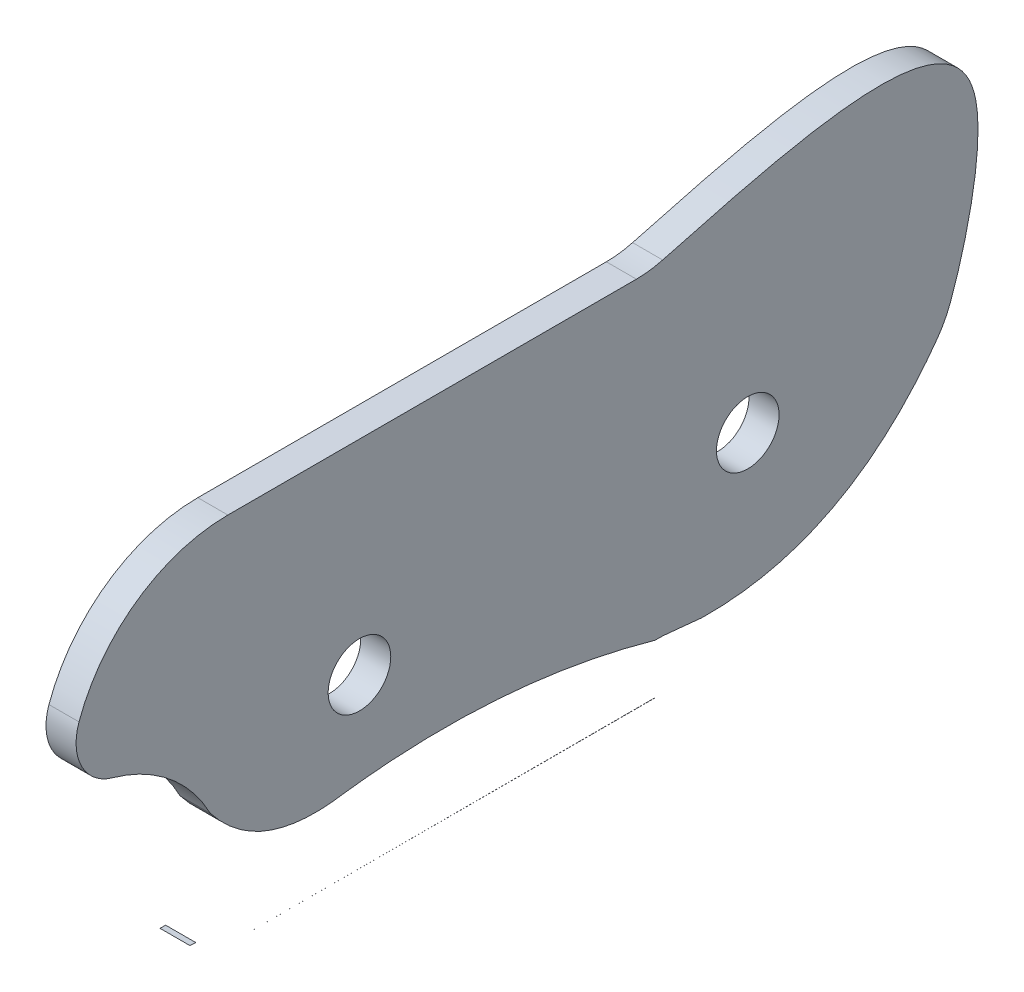
ISO-10303-21;
HEADER;
FILE_DESCRIPTION(('STEP AP214'),'2;1');
FILE_NAME('part.step','',(''),(''),'','','');
FILE_SCHEMA(('AUTOMOTIVE_DESIGN { 1 0 10303 214 1 1 1 1 }'));
ENDSEC;
DATA;
#1=APPLICATION_CONTEXT('core data for automotive mechanical design processes');
#2=APPLICATION_PROTOCOL_DEFINITION('international standard','automotive_design',2000,#1);
#3=PRODUCT_CONTEXT('',#1,'mechanical');
#4=PRODUCT('Part','Part','',(#3));
#5=PRODUCT_RELATED_PRODUCT_CATEGORY('part','',(#4));
#6=PRODUCT_DEFINITION_FORMATION('','',#4);
#7=PRODUCT_DEFINITION_CONTEXT('part definition',#1,'design');
#8=PRODUCT_DEFINITION('design','',#6,#7);
#9=PRODUCT_DEFINITION_SHAPE('','',#8);
#10=(LENGTH_UNIT() NAMED_UNIT(*) SI_UNIT(.MILLI.,.METRE.));
#11=(NAMED_UNIT(*) PLANE_ANGLE_UNIT() SI_UNIT($,.RADIAN.));
#12=(NAMED_UNIT(*) SI_UNIT($,.STERADIAN.) SOLID_ANGLE_UNIT());
#13=UNCERTAINTY_MEASURE_WITH_UNIT(LENGTH_MEASURE(1.E-05),#10,'distance_accuracy_value','');
#14=(GEOMETRIC_REPRESENTATION_CONTEXT(3) GLOBAL_UNCERTAINTY_ASSIGNED_CONTEXT((#13)) GLOBAL_UNIT_ASSIGNED_CONTEXT((#10,
#11,#12)) REPRESENTATION_CONTEXT('',''));
#15=CARTESIAN_POINT('',(0.,0.,0.));
#16=DIRECTION('',(0.,0.,1.));
#17=DIRECTION('',(1.,0.,0.));
#18=AXIS2_PLACEMENT_3D('',#15,#16,#17);
#19=CARTESIAN_POINT('',(2.99955603653953,-19.5179085511998,-55.8213036068836));
#20=DIRECTION('',(1.,0.,0.));
#21=DIRECTION('',(0.,0.,-1.));
#22=AXIS2_PLACEMENT_3D('',#19,#20,#21);
#23=PLANE('',#22);
#24=DIRECTION('',(0.,0.000206354055921188,-0.999999978709002));
#25=VECTOR('',#24,1.);
#26=CARTESIAN_POINT('',(2.99955603653953,-32.136560733828,-56.2427936134168));
#27=LINE('',#26,#25);
#28=CARTESIAN_POINT('',(2.99955603653953,-32.1435981059035,-22.1394080788982));
#29=VERTEX_POINT('',#28);
#30=CARTESIAN_POINT('',(2.99955603653953,-32.136560733828,-56.2427936134168));
#31=VERTEX_POINT('',#30);
#32=EDGE_CURVE('E80',#29,#31,#27,.T.);
#33=ORIENTED_EDGE('',*,*,#32,.F.);
#34=DIRECTION('',(0.,0.,-1.));
#35=VECTOR('',#34,1.);
#36=CARTESIAN_POINT('',(2.99955603653953,-32.1435981059035,-22.1394080788982));
#37=LINE('',#36,#35);
#38=CARTESIAN_POINT('',(2.99955603653953,-32.1435981059035,-55.8213036068835));
#39=VERTEX_POINT('',#38);
#40=EDGE_CURVE('E85',#29,#39,#37,.T.);
#41=ORIENTED_EDGE('',*,*,#40,.T.);
#42=CARTESIAN_POINT('',(2.99955603653953,-19.5179085511998,-55.8213036068836));
#43=DIRECTION('',(1.,0.,0.));
#44=DIRECTION('',(0.,0.,-1.));
#45=AXIS2_PLACEMENT_3D('',#42,#43,#44);
#46=CIRCLE('',#45,12.6256895547037);
#47=EDGE_CURVE('E78',#39,#31,#46,.T.);
#48=ORIENTED_EDGE('',*,*,#47,.T.);
#49=EDGE_LOOP('',(#33,#41,#48));
#50=FACE_BOUND('',#49,.T.);
#51=ADVANCED_FACE('F50',(#50),#23,.T.);
#52=CARTESIAN_POINT('',(0.599556036539527,-32.136560733828,-56.2427936134168));
#53=DIRECTION('',(0.,-0.999999978709001,-0.000206354055921188));
#54=DIRECTION('',(0.,0.000206354055921188,-0.999999978709002));
#55=AXIS2_PLACEMENT_3D('',#52,#53,#54);
#56=PLANE('',#55);
#57=ORIENTED_EDGE('',*,*,#32,.T.);
#58=CARTESIAN_POINT('',(2.99955603653953,-32.136560733828,-56.2427936134168));
#59=CARTESIAN_POINT('',(2.99718008336629,-32.1365752257119,-56.1725653664588));
#60=CARTESIAN_POINT('',(2.99540193754885,-32.1365897196685,-56.1023270749214));
#61=CARTESIAN_POINT('',(2.99304126068252,-32.1366187117266,-55.961830406076));
#62=CARTESIAN_POINT('',(2.99245872957596,-32.136633209828,-55.891572028769));
#63=CARTESIAN_POINT('',(2.99247400576753,-32.1366477100022,-55.8213036068835));
#64=B_SPLINE_CURVE_WITH_KNOTS('',3,(#58,#59,#60,#61,#62,#63),.UNSPECIFIED.,.F.,.F.,(4,2,4),(0.,
0.210782391333911,0.421564772501056),.UNSPECIFIED.);
#65=CARTESIAN_POINT('',(2.99247400576753,-32.1366477100022,-55.8213036068835));
#66=VERTEX_POINT('',#65);
#67=EDGE_CURVE('E13',#31,#66,#64,.T.);
#68=ORIENTED_EDGE('',*,*,#67,.T.);
#69=CARTESIAN_POINT('',(8.59955603653953,-26.4304553630692,-27708.2568225956));
#70=DIRECTION('',(0.,-0.999999978709001,-0.000206354055921188));
#71=DIRECTION('',(0.,0.000206354055921188,-0.999999978709002));
#72=AXIS2_PLACEMENT_3D('',#69,#70,#71);
#73=ELLIPSE('',#72,38768.319645025,8.);
#74=EDGE_CURVE('E59',#66,#29,#73,.F.);
#75=ORIENTED_EDGE('',*,*,#74,.T.);
#76=EDGE_LOOP('',(#57,#68,#75));
#77=FACE_BOUND('',#76,.T.);
#78=ADVANCED_FACE('F81',(#77),#56,.F.);
#79=CARTESIAN_POINT('',(8.59955603653953,-26.4304553630692,-22.1394080788982));
#80=DIRECTION('',(0.,0.,-1.));
#81=DIRECTION('',(-1.,0.,0.));
#82=AXIS2_PLACEMENT_3D('',#79,#80,#81);
#83=CYLINDRICAL_SURFACE('',#82,8.);
#84=CARTESIAN_POINT('',(8.59955603653953,-26.4304553630692,-55.8213036068835));
#85=DIRECTION('',(0.,0.,-1.));
#86=DIRECTION('',(-1.,0.,0.));
#87=AXIS2_PLACEMENT_3D('',#84,#85,#86);
#88=CIRCLE('',#87,8.);
#89=EDGE_CURVE('E54',#39,#66,#88,.T.);
#90=ORIENTED_EDGE('',*,*,#89,.F.);
#91=ORIENTED_EDGE('',*,*,#40,.F.);
#92=ORIENTED_EDGE('',*,*,#74,.F.);
#93=EDGE_LOOP('',(#90,#91,#92));
#94=FACE_BOUND('',#93,.T.);
#95=ADVANCED_FACE('F52',(#94),#83,.T.);
#96=CARTESIAN_POINT('',(8.59955603653953,-19.5179085511998,-55.8213036068836));
#97=DIRECTION('',(-1.,0.,0.));
#98=DIRECTION('',(0.,0.,1.));
#99=AXIS2_PLACEMENT_3D('',#96,#97,#98);
#100=DEGENERATE_TOROIDAL_SURFACE('',#99,6.91254681186938,8.,.T.);
#101=ORIENTED_EDGE('',*,*,#47,.F.);
#102=ORIENTED_EDGE('',*,*,#89,.T.);
#103=ORIENTED_EDGE('',*,*,#67,.F.);
#104=EDGE_LOOP('',(#101,#102,#103));
#105=FACE_BOUND('',#104,.T.);
#106=ADVANCED_FACE('F76',(#105),#100,.T.);
#107=CLOSED_SHELL('',(#51,#78,#95,#106));
#108=MANIFOLD_SOLID_BREP('B2',#107);
#109=CARTESIAN_POINT('',(1.49999999999991,-27.0316510257163,-19.8045201979243));
#110=DIRECTION('',(1.,0.,0.));
#111=DIRECTION('',(0.,0.,-1.));
#112=AXIS2_PLACEMENT_3D('',#109,#110,#111);
#113=CYLINDRICAL_SURFACE('',#112,4.);
#114=DIRECTION('',(-1.,0.,0.));
#115=VECTOR('',#114,1.);
#116=CARTESIAN_POINT('',(2.70720028270219,-31.0316510257163,-19.8045201979243));
#117=LINE('',#116,#115);
#118=CARTESIAN_POINT('',(2.69999999999991,-31.0316510257163,-19.8045201979241));
#119=VERTEX_POINT('',#118);
#120=CARTESIAN_POINT('',(0.299999999999908,-31.0316510257163,-19.8045201979243));
#121=VERTEX_POINT('',#120);
#122=EDGE_CURVE('E48',#119,#121,#117,.T.);
#123=ORIENTED_EDGE('',*,*,#122,.F.);
#124=CARTESIAN_POINT('',(2.69999999999991,-27.0316510257163,-19.8045201979243));
#125=DIRECTION('',(1.,0.,0.));
#126=DIRECTION('',(0.,0.,-1.));
#127=AXIS2_PLACEMENT_3D('',#124,#125,#126);
#128=CIRCLE('',#127,4.);
#129=CARTESIAN_POINT('',(2.69999999999991,-31.0036666113384,-19.332193840863));
#130=VERTEX_POINT('',#129);
#131=EDGE_CURVE('E182',#130,#119,#128,.T.);
#132=ORIENTED_EDGE('',*,*,#131,.F.);
#133=DIRECTION('',(-1.,0.,0.));
#134=VECTOR('',#133,1.);
#135=CARTESIAN_POINT('',(2.70720028270219,-31.0036666113383,-19.332193840863));
#136=LINE('',#135,#134);
#137=CARTESIAN_POINT('',(0.299999999999908,-31.0036666113384,-19.332193840863));
#138=VERTEX_POINT('',#137);
#139=EDGE_CURVE('E156',#138,#130,#136,.F.);
#140=ORIENTED_EDGE('',*,*,#139,.F.);
#141=CARTESIAN_POINT('',(0.299999999999908,-27.0316510257163,-19.8045201979243));
#142=DIRECTION('',(1.,0.,0.));
#143=DIRECTION('',(0.,0.,-1.));
#144=AXIS2_PLACEMENT_3D('',#141,#142,#143);
#145=CIRCLE('',#144,4.);
#146=EDGE_CURVE('E180',#121,#138,#145,.F.);
#147=ORIENTED_EDGE('',*,*,#146,.F.);
#148=EDGE_LOOP('',(#123,#132,#140,#147));
#149=FACE_BOUND('',#148,.T.);
#150=ADVANCED_FACE('F149',(#149),#113,.T.);
#151=CARTESIAN_POINT('',(0.299999999999908,-19.2941411093119,-50.2212508985136));
#152=DIRECTION('',(1.,0.,0.));
#153=DIRECTION('',(0.,0.,-1.));
#154=AXIS2_PLACEMENT_3D('',#151,#152,#153);
#155=PLANE('',#154);
#156=ORIENTED_EDGE('',*,*,#146,.T.);
#157=CARTESIAN_POINT('',(0.299999999999908,-30.0843718117476,-25.7618457675913));
#158=CARTESIAN_POINT('',(0.299999999999908,-31.8530301146714,-21.6838335634753));
#159=CARTESIAN_POINT('',(0.299999999999908,-31.8792604732779,-11.1308681420773));
#160=CARTESIAN_POINT('',(0.299999999999908,-24.0001452357607,-13.7466012599959));
#161=B_SPLINE_CURVE_WITH_KNOTS('',3,(#157,#158,#159,#160),.UNSPECIFIED.,.F.,.F.,(4,4),(0.,1.),.UNSPECIFIED.);
#162=EDGE_CURVE('E162',#121,#138,#161,.T.);
#163=ORIENTED_EDGE('',*,*,#162,.F.);
#164=EDGE_LOOP('',(#156,#163));
#165=FACE_BOUND('',#164,.T.);
#166=ADVANCED_FACE('F179',(#165),#155,.F.);
#167=CARTESIAN_POINT('',(2.69999999999991,-19.2941411093119,-50.2212508985136));
#168=DIRECTION('',(1.,0.,0.));
#169=DIRECTION('',(0.,0.,-1.));
#170=AXIS2_PLACEMENT_3D('',#167,#168,#169);
#171=PLANE('',#170);
#172=CARTESIAN_POINT('',(2.69999999999991,-30.0843718117476,-25.7618457675913));
#173=CARTESIAN_POINT('',(2.69999999999991,-31.8530301146714,-21.6838335634753));
#174=CARTESIAN_POINT('',(2.69999999999991,-31.8792604732779,-11.1308681420773));
#175=CARTESIAN_POINT('',(2.69999999999991,-24.0001452357607,-13.7466012599959));
#176=B_SPLINE_CURVE_WITH_KNOTS('',3,(#172,#173,#174,#175),.UNSPECIFIED.,.F.,.F.,(4,4),(0.,1.),.UNSPECIFIED.);
#177=EDGE_CURVE('E167',#130,#119,#176,.F.);
#178=ORIENTED_EDGE('',*,*,#177,.F.);
#179=ORIENTED_EDGE('',*,*,#131,.T.);
#180=EDGE_LOOP('',(#178,#179));
#181=FACE_BOUND('',#180,.T.);
#182=ADVANCED_FACE('F189',(#181),#171,.T.);
#183=CARTESIAN_POINT('',(2.70720028270219,-30.0843718117476,-25.7618457675913));
#184=CARTESIAN_POINT('',(2.70720028270219,-31.8530301146714,-21.6838335634753));
#185=CARTESIAN_POINT('',(2.70720028270219,-31.8792604732779,-11.1308681420773));
#186=CARTESIAN_POINT('',(2.70720028270219,-24.0001452357607,-13.7466012599959));
#187=B_SPLINE_CURVE_WITH_KNOTS('',3,(#183,#184,#185,#186),.UNSPECIFIED.,.F.,.F.,(4,4),(0.,1.),.UNSPECIFIED.);
#188=DIRECTION('',(-1.,0.,0.));
#189=VECTOR('',#188,1.);
#190=SURFACE_OF_LINEAR_EXTRUSION('',#187,#189);
#191=ORIENTED_EDGE('',*,*,#122,.T.);
#192=ORIENTED_EDGE('',*,*,#162,.T.);
#193=ORIENTED_EDGE('',*,*,#139,.T.);
#194=ORIENTED_EDGE('',*,*,#177,.T.);
#195=EDGE_LOOP('',(#191,#192,#193,#194));
#196=FACE_BOUND('',#195,.T.);
#197=ADVANCED_FACE('F172',(#196),#190,.F.);
#198=CLOSED_SHELL('',(#150,#166,#182,#197));
#199=MANIFOLD_SOLID_BREP('B7',#198);
#200=CARTESIAN_POINT('',(2.70000673828095,-28.4672984633122,-9.73703785864154));
#201=DIRECTION('',(-1.,0.,0.));
#202=DIRECTION('',(0.,0.,1.));
#203=AXIS2_PLACEMENT_3D('',#200,#201,#202);
#204=CYLINDRICAL_SURFACE('',#203,12.6256895547038);
#205=CARTESIAN_POINT('',(0.300006738280949,-28.4672984633122,-9.73703785864154));
#206=DIRECTION('',(-1.,0.,0.));
#207=DIRECTION('',(0.,0.,-1.));
#208=AXIS2_PLACEMENT_3D('',#205,#206,#207);
#209=CIRCLE('',#208,12.6256895547038);
#210=CARTESIAN_POINT('',(0.300006738280949,-16.314349606581,-13.1595911186264));
#211=VERTEX_POINT('',#210);
#212=CARTESIAN_POINT('',(0.300006738280949,-22.6541610970109,-20.9448686341426));
#213=VERTEX_POINT('',#212);
#214=EDGE_CURVE('E264',#211,#213,#209,.T.);
#215=ORIENTED_EDGE('',*,*,#214,.T.);
#216=DIRECTION('',(-1.,0.,0.));
#217=VECTOR('',#216,1.);
#218=CARTESIAN_POINT('',(2.70720702098323,-22.6541610970109,-20.9448686341426));
#219=LINE('',#218,#217);
#220=CARTESIAN_POINT('',(2.70000673828095,-22.6541610970106,-20.9448686341424));
#221=VERTEX_POINT('',#220);
#222=EDGE_CURVE('E353',#213,#221,#219,.F.);
#223=ORIENTED_EDGE('',*,*,#222,.T.);
#224=CARTESIAN_POINT('',(2.70000673828095,-28.4672984633122,-9.73703785864154));
#225=DIRECTION('',(-1.,0.,0.));
#226=DIRECTION('',(0.,0.,-1.));
#227=AXIS2_PLACEMENT_3D('',#224,#225,#226);
#228=CIRCLE('',#227,12.6256895547038);
#229=CARTESIAN_POINT('',(2.70000673828095,-16.314349606581,-13.1595911186264));
#230=VERTEX_POINT('',#229);
#231=EDGE_CURVE('E273',#230,#221,#228,.T.);
#232=ORIENTED_EDGE('',*,*,#231,.F.);
#233=DIRECTION('',(-1.,0.,0.));
#234=VECTOR('',#233,1.);
#235=CARTESIAN_POINT('',(2.70000673828095,-16.314349606581,-13.1595911186264));
#236=LINE('',#235,#234);
#237=EDGE_CURVE('E466',#230,#211,#236,.T.);
#238=ORIENTED_EDGE('',*,*,#237,.T.);
#239=EDGE_LOOP('',(#215,#223,#232,#238));
#240=FACE_BOUND('',#239,.T.);
#241=ADVANCED_FACE('F243',(#240),#204,.F.);
#242=CARTESIAN_POINT('',(0.300006738280949,-28.4602610912366,-56.466112947864));
#243=CARTESIAN_POINT('',(0.300006738280949,-23.759836546323,-39.8660800885755));
#244=CARTESIAN_POINT('',(0.300006738280949,-28.4672984633121,-22.3627274133454));
#245=B_SPLINE_CURVE_WITH_KNOTS('',2,(#242,#243,#244),.UNSPECIFIED.,.F.,.F.,(3,3),(0.,1.),.UNSPECIFIED.);
#246=DIRECTION('',(1.,0.,0.));
#247=VECTOR('',#246,1.);
#248=SURFACE_OF_LINEAR_EXTRUSION('',#245,#247);
#249=CARTESIAN_POINT('',(2.70000673828095,-28.4602610912366,-56.466112947864));
#250=CARTESIAN_POINT('',(2.70000673828095,-23.759836546323,-39.8660800885755));
#251=CARTESIAN_POINT('',(2.70000673828095,-28.4672984633121,-22.3627274133454));
#252=B_SPLINE_CURVE_WITH_KNOTS('',2,(#249,#250,#251),.UNSPECIFIED.,.F.,.F.,(3,3),(0.,1.),.UNSPECIFIED.);
#253=CARTESIAN_POINT('',(2.70000673828095,-28.4602610912366,-56.466112947864));
#254=VERTEX_POINT('',#253);
#255=CARTESIAN_POINT('',(2.70000673828095,-26.6318430562157,-31.5851909204892));
#256=VERTEX_POINT('',#255);
#257=EDGE_CURVE('E346',#254,#256,#252,.T.);
#258=ORIENTED_EDGE('',*,*,#257,.T.);
#259=CARTESIAN_POINT('',(2.70000673828095,-26.6318430562157,-31.5851909204892));
#260=CARTESIAN_POINT('',(2.70000673828095,-26.6801405115611,-31.2082301417992));
#261=CARTESIAN_POINT('',(2.70000673828095,-26.7329235087706,-30.8308386735098));
#262=B_SPLINE_CURVE_WITH_KNOTS('',2,(#259,#260,#261),.UNSPECIFIED.,.F.,.F.,(3,3),
(0.734735799910028,0.756571213550189),.UNSPECIFIED.);
#263=CARTESIAN_POINT('',(2.70000673828095,-26.7329235087706,-30.8308386735098));
#264=VERTEX_POINT('',#263);
#265=EDGE_CURVE('E342',#256,#264,#262,.T.);
#266=ORIENTED_EDGE('',*,*,#265,.T.);
#267=DIRECTION('',(-1.,0.,0.));
#268=VECTOR('',#267,1.);
#269=CARTESIAN_POINT('',(2.70720702098323,-26.7329235087706,-30.8308386735098));
#270=LINE('',#269,#268);
#271=CARTESIAN_POINT('',(0.300006738280949,-26.7329235078698,-30.8308386799504));
#272=VERTEX_POINT('',#271);
#273=EDGE_CURVE('E352',#264,#272,#270,.T.);
#274=ORIENTED_EDGE('',*,*,#273,.T.);
#275=CARTESIAN_POINT('',(0.300006738280949,-28.4602610912366,-56.466112947864));
#276=VERTEX_POINT('',#275);
#277=EDGE_CURVE('E444',#276,#272,#245,.T.);
#278=ORIENTED_EDGE('',*,*,#277,.F.);
#279=DIRECTION('',(1.,0.,0.));
#280=VECTOR('',#279,1.);
#281=CARTESIAN_POINT('',(0.300006738280949,-28.4602610912366,-56.466112947864));
#282=LINE('',#281,#280);
#283=EDGE_CURVE('E358',#276,#254,#282,.T.);
#284=ORIENTED_EDGE('',*,*,#283,.T.);
#285=EDGE_LOOP('',(#258,#266,#274,#278,#284));
#286=FACE_BOUND('',#285,.T.);
#287=ADVANCED_FACE('F356',(#286),#248,.F.);
#288=CARTESIAN_POINT('',(2.70000673828095,-15.8416089086085,-56.0446229413308));
#289=DIRECTION('',(1.,0.,0.));
#290=DIRECTION('',(0.,0.,-1.));
#291=AXIS2_PLACEMENT_3D('',#288,#289,#290);
#292=PLANE('',#291);
#293=CARTESIAN_POINT('',(2.70000673828095,-19.0478221430528,-32.8665233091632));
#294=DIRECTION('',(1.,0.,0.));
#295=DIRECTION('',(0.,0.,-1.));
#296=AXIS2_PLACEMENT_3D('',#293,#294,#295);
#297=CIRCLE('',#296,2.5);
#298=CARTESIAN_POINT('',(2.70000673828095,-19.0478221430528,-35.3665233091632));
#299=VERTEX_POINT('',#298);
#300=EDGE_CURVE('E462',#299,#299,#297,.T.);
#301=ORIENTED_EDGE('',*,*,#300,.F.);
#302=EDGE_LOOP('',(#301));
#303=FACE_BOUND('',#302,.T.);
#304=CARTESIAN_POINT('',(2.70000673828095,-17.8125458830528,-63.8665233041426));
#305=DIRECTION('',(1.,0.,0.));
#306=DIRECTION('',(0.,0.,-1.));
#307=AXIS2_PLACEMENT_3D('',#304,#305,#306);
#308=CIRCLE('',#307,2.49999999999999);
#309=CARTESIAN_POINT('',(2.70000673828095,-17.8125458830528,-66.3665233041426));
#310=VERTEX_POINT('',#309);
#311=EDGE_CURVE('E450',#310,#310,#308,.F.);
#312=ORIENTED_EDGE('',*,*,#311,.T.);
#313=EDGE_LOOP('',(#312));
#314=FACE_BOUND('',#313,.T.);
#315=CARTESIAN_POINT('',(2.70000673828095,-20.5476130350573,-19.569973302813));
#316=CARTESIAN_POINT('',(2.70000673828095,-27.8938724730232,-23.6099525584449));
#317=CARTESIAN_POINT('',(2.70000673828095,-26.6318396110441,-31.5852178104085));
#318=B_SPLINE_CURVE_WITH_KNOTS('',2,(#315,#316,#317),.UNSPECIFIED.,.F.,.F.,(3,3),(0.,1.),.UNSPECIFIED.);
#319=EDGE_CURVE('E147',#264,#221,#318,.F.);
#320=ORIENTED_EDGE('',*,*,#319,.F.);
#321=ORIENTED_EDGE('',*,*,#265,.F.);
#322=ORIENTED_EDGE('',*,*,#257,.F.);
#323=CARTESIAN_POINT('',(2.70000673828095,-36.4583666134953,-56.6402050350353));
#324=DIRECTION('',(1.,0.,0.));
#325=DIRECTION('',(0.,0.,-1.));
#326=AXIS2_PLACEMENT_3D('',#323,#324,#325);
#327=CIRCLE('',#326,8.);
#328=CARTESIAN_POINT('',(2.70000673828095,-28.5033745661538,-57.487613747956));
#329=VERTEX_POINT('',#328);
#330=EDGE_CURVE('E360',#254,#329,#327,.F.);
#331=ORIENTED_EDGE('',*,*,#330,.T.);
#332=CARTESIAN_POINT('',(2.70000673828095,-2.75171897906268,-56.0446229413307));
#333=CARTESIAN_POINT('',(2.70000673828095,0.420331533337199,-67.7128035294621));
#334=CARTESIAN_POINT('',(2.70000673828095,4.76085561403754,-83.6791378052763));
#335=CARTESIAN_POINT('',(2.70000673828095,-15.6951693868958,-81.4924574964524));
#336=CARTESIAN_POINT('',(2.70000673828095,-30.2923803653252,-74.1822347519953));
#337=CARTESIAN_POINT('',(2.70000673828095,-29.0133577374414,-62.2458299755699));
#338=CARTESIAN_POINT('',(2.70000673828095,-28.4391568200636,-56.8871330898422));
#339=B_SPLINE_CURVE_WITH_KNOTS('',3,(#332,#333,#334,#335,#336,#337,#338),.UNSPECIFIED.,.F.,.F.,
(4,1,1,1,4),(0.,0.376783583733936,0.5155776088737,0.782524737781,1.),.UNSPECIFIED.);
#340=CARTESIAN_POINT('',(2.70000673828095,-28.7745396662051,-60.2193864833847));
#341=VERTEX_POINT('',#340);
#342=EDGE_CURVE('E386',#341,#329,#339,.T.);
#343=ORIENTED_EDGE('',*,*,#342,.F.);
#344=CARTESIAN_POINT('',(2.70000673828095,-28.4602610912366,-56.466112947864));
#345=CARTESIAN_POINT('',(2.70000673828095,-30.6302866679332,-71.121495174714));
#346=CARTESIAN_POINT('',(2.70000673828095,-17.9658268358857,-79.62400075825));
#347=B_SPLINE_CURVE_WITH_KNOTS('',2,(#344,#345,#346),.UNSPECIFIED.,.F.,.F.,(3,3),(0.,1.),.UNSPECIFIED.);
#348=CARTESIAN_POINT('',(2.70000673828095,-18.8484159308046,-79.0110542743522));
#349=VERTEX_POINT('',#348);
#350=EDGE_CURVE('E364',#341,#349,#347,.T.);
#351=ORIENTED_EDGE('',*,*,#350,.T.);
#352=CARTESIAN_POINT('',(2.70000673828095,-14.1799193487291,-72.5145059859802));
#353=DIRECTION('',(1.,0.,0.));
#354=DIRECTION('',(0.,0.,-1.));
#355=AXIS2_PLACEMENT_3D('',#352,#353,#354);
#356=CIRCLE('',#355,8.);
#357=CARTESIAN_POINT('',(2.70000673828095,-16.963700767191,-80.0145433868354));
#358=VERTEX_POINT('',#357);
#359=EDGE_CURVE('E512',#349,#358,#356,.T.);
#360=ORIENTED_EDGE('',*,*,#359,.T.);
#361=CARTESIAN_POINT('',(2.70000673828095,-2.47254588305283,-57.0721937091632));
#362=VERTEX_POINT('',#361);
#363=EDGE_CURVE('E374',#362,#358,#339,.T.);
#364=ORIENTED_EDGE('',*,*,#363,.F.);
#365=CARTESIAN_POINT('',(2.70000673828095,5.24828102093733,-54.9772397911446));
#366=DIRECTION('',(1.,0.,0.));
#367=DIRECTION('',(0.,0.,-1.));
#368=AXIS2_PLACEMENT_3D('',#365,#366,#367);
#369=CIRCLE('',#368,8.);
#370=CARTESIAN_POINT('',(2.70000673828095,-2.75171897906267,-54.9772397911445));
#371=VERTEX_POINT('',#370);
#372=EDGE_CURVE('E552',#362,#371,#369,.F.);
#373=ORIENTED_EDGE('',*,*,#372,.T.);
#374=DIRECTION('',(0.,0.,1.));
#375=VECTOR('',#374,1.);
#376=CARTESIAN_POINT('',(2.70000673828095,-2.75171897906267,-22.3627274133454));
#377=LINE('',#376,#375);
#378=CARTESIAN_POINT('',(2.70000673828095,-2.75171897906267,-22.3627274133454));
#379=VERTEX_POINT('',#378);
#380=EDGE_CURVE('E550',#371,#379,#377,.T.);
#381=ORIENTED_EDGE('',*,*,#380,.T.);
#382=CARTESIAN_POINT('',(2.70000673828095,-15.3774085337663,-22.3627274133453));
#383=DIRECTION('',(1.,0.,0.));
#384=DIRECTION('',(0.,0.,-1.));
#385=AXIS2_PLACEMENT_3D('',#382,#383,#384);
#386=CIRCLE('',#385,12.6256895547037);
#387=CARTESIAN_POINT('',(2.70000673828095,-11.1131386365895,-10.4789553280272));
#388=VERTEX_POINT('',#387);
#389=EDGE_CURVE('E495',#379,#388,#386,.T.);
#390=ORIENTED_EDGE('',*,*,#389,.T.);
#391=CARTESIAN_POINT('',(2.70000673828095,-12.4641206573975,-14.2439052054431));
#392=DIRECTION('',(1.,0.,0.));
#393=DIRECTION('',(0.,0.,-1.));
#394=AXIS2_PLACEMENT_3D('',#391,#392,#393);
#395=CIRCLE('',#394,4.);
#396=EDGE_CURVE('E492',#388,#230,#395,.T.);
#397=ORIENTED_EDGE('',*,*,#396,.T.);
#398=ORIENTED_EDGE('',*,*,#231,.T.);
#399=EDGE_LOOP('',(#320,#321,#322,#331,#343,#351,#360,#364,#373,#381,#390,#397,#398));
#400=FACE_BOUND('',#399,.T.);
#401=ADVANCED_FACE('F245',(#303,#314,#400),#292,.T.);
#402=CARTESIAN_POINT('',(0.300006738280949,-15.8416089086085,-56.0446229413308));
#403=DIRECTION('',(1.,0.,0.));
#404=DIRECTION('',(0.,0.,-1.));
#405=AXIS2_PLACEMENT_3D('',#402,#403,#404);
#406=PLANE('',#405);
#407=CARTESIAN_POINT('',(0.300006738280949,-19.0478221430528,-32.8665233091632));
#408=DIRECTION('',(-1.,0.,0.));
#409=DIRECTION('',(0.,0.,1.));
#410=AXIS2_PLACEMENT_3D('',#407,#408,#409);
#411=CIRCLE('',#410,2.5);
#412=CARTESIAN_POINT('',(0.300006738280949,-19.0478221430528,-30.3665233091632));
#413=VERTEX_POINT('',#412);
#414=EDGE_CURVE('E470',#413,#413,#411,.T.);
#415=ORIENTED_EDGE('',*,*,#414,.F.);
#416=EDGE_LOOP('',(#415));
#417=FACE_BOUND('',#416,.T.);
#418=CARTESIAN_POINT('',(0.300006738280949,-17.8125458830528,-63.8665233041426));
#419=DIRECTION('',(-1.,0.,0.));
#420=DIRECTION('',(0.,0.,1.));
#421=AXIS2_PLACEMENT_3D('',#418,#419,#420);
#422=CIRCLE('',#421,2.49999999999999);
#423=CARTESIAN_POINT('',(0.300006738280949,-17.8125458830528,-61.3665233041426));
#424=VERTEX_POINT('',#423);
#425=EDGE_CURVE('E461',#424,#424,#422,.T.);
#426=ORIENTED_EDGE('',*,*,#425,.F.);
#427=EDGE_LOOP('',(#426));
#428=FACE_BOUND('',#427,.T.);
#429=ORIENTED_EDGE('',*,*,#277,.T.);
#430=CARTESIAN_POINT('',(0.300006738280949,-20.5476130350573,-19.569973302813));
#431=CARTESIAN_POINT('',(0.300006738280949,-27.8938724730232,-23.6099525584449));
#432=CARTESIAN_POINT('',(0.300006738280949,-26.6318396110441,-31.5852178104085));
#433=B_SPLINE_CURVE_WITH_KNOTS('',2,(#430,#431,#432),.UNSPECIFIED.,.F.,.F.,(3,3),(0.,1.),.UNSPECIFIED.);
#434=EDGE_CURVE('E256',#213,#272,#433,.T.);
#435=ORIENTED_EDGE('',*,*,#434,.F.);
#436=ORIENTED_EDGE('',*,*,#214,.F.);
#437=CARTESIAN_POINT('',(0.300006738280949,-12.4641206573975,-14.2439052054431));
#438=DIRECTION('',(1.,0.,0.));
#439=DIRECTION('',(0.,0.,-1.));
#440=AXIS2_PLACEMENT_3D('',#437,#438,#439);
#441=CIRCLE('',#440,4.);
#442=CARTESIAN_POINT('',(0.300006738280949,-11.1131386365895,-10.4789553280272));
#443=VERTEX_POINT('',#442);
#444=EDGE_CURVE('E487',#211,#443,#441,.F.);
#445=ORIENTED_EDGE('',*,*,#444,.T.);
#446=CARTESIAN_POINT('',(0.300006738280949,-15.3774085337663,-22.3627274133453));
#447=DIRECTION('',(1.,0.,0.));
#448=DIRECTION('',(0.,0.,-1.));
#449=AXIS2_PLACEMENT_3D('',#446,#447,#448);
#450=CIRCLE('',#449,12.6256895547037);
#451=CARTESIAN_POINT('',(0.300006738280949,-2.75171897906267,-22.3627274133454));
#452=VERTEX_POINT('',#451);
#453=EDGE_CURVE('E535',#452,#443,#450,.T.);
#454=ORIENTED_EDGE('',*,*,#453,.F.);
#455=DIRECTION('',(0.,0.,1.));
#456=VECTOR('',#455,1.);
#457=CARTESIAN_POINT('',(0.300006738280949,-2.75171897906267,-22.3627274133454));
#458=LINE('',#457,#456);
#459=CARTESIAN_POINT('',(0.300006738280949,-2.75171897906267,-54.9772397911445));
#460=VERTEX_POINT('',#459);
#461=EDGE_CURVE('E543',#460,#452,#458,.T.);
#462=ORIENTED_EDGE('',*,*,#461,.F.);
#463=CARTESIAN_POINT('',(0.300006738280949,5.24828102093733,-54.9772397911446));
#464=DIRECTION('',(1.,0.,0.));
#465=DIRECTION('',(0.,0.,-1.));
#466=AXIS2_PLACEMENT_3D('',#463,#464,#465);
#467=CIRCLE('',#466,8.);
#468=CARTESIAN_POINT('',(0.300006738280949,-2.47254588305283,-57.0721937091632));
#469=VERTEX_POINT('',#468);
#470=EDGE_CURVE('E490',#460,#469,#467,.T.);
#471=ORIENTED_EDGE('',*,*,#470,.T.);
#472=CARTESIAN_POINT('',(0.300006738280949,-2.75171897906268,-56.0446229413307));
#473=CARTESIAN_POINT('',(0.300006738280949,0.420331533337199,-67.7128035294621));
#474=CARTESIAN_POINT('',(0.300006738280949,4.76085561403754,-83.6791378052763));
#475=CARTESIAN_POINT('',(0.300006738280949,-15.6951693868958,-81.4924574964524));
#476=CARTESIAN_POINT('',(0.300006738280949,-30.2923803653252,-74.1822347519953));
#477=CARTESIAN_POINT('',(0.300006738280949,-29.0133577374414,-62.2458299755699));
#478=CARTESIAN_POINT('',(0.300006738280949,-28.4391568200636,-56.8871330898422));
#479=B_SPLINE_CURVE_WITH_KNOTS('',3,(#472,#473,#474,#475,#476,#477,#478),.UNSPECIFIED.,.F.,.F.,
(4,1,1,1,4),(0.,0.376783583733936,0.5155776088737,0.782524737781,1.),.UNSPECIFIED.);
#480=CARTESIAN_POINT('',(0.300006738280949,-16.963700767191,-80.0145433868353));
#481=VERTEX_POINT('',#480);
#482=EDGE_CURVE('E387',#469,#481,#479,.T.);
#483=ORIENTED_EDGE('',*,*,#482,.T.);
#484=CARTESIAN_POINT('',(0.300006738280949,-14.1799193487291,-72.5145059859802));
#485=DIRECTION('',(1.,0.,0.));
#486=DIRECTION('',(0.,0.,-1.));
#487=AXIS2_PLACEMENT_3D('',#484,#485,#486);
#488=CIRCLE('',#487,8.);
#489=CARTESIAN_POINT('',(0.300006738280949,-18.8484159308046,-79.0110542743522));
#490=VERTEX_POINT('',#489);
#491=EDGE_CURVE('E617',#481,#490,#488,.F.);
#492=ORIENTED_EDGE('',*,*,#491,.T.);
#493=CARTESIAN_POINT('',(0.300006738280949,-28.4602610912366,-56.466112947864));
#494=CARTESIAN_POINT('',(0.300006738280949,-30.6302866679332,-71.121495174714));
#495=CARTESIAN_POINT('',(0.300006738280949,-17.9658268358857,-79.62400075825));
#496=B_SPLINE_CURVE_WITH_KNOTS('',2,(#493,#494,#495),.UNSPECIFIED.,.F.,.F.,(3,3),(0.,1.),.UNSPECIFIED.);
#497=CARTESIAN_POINT('',(0.300006738280948,-28.7745396662051,-60.2193864833847));
#498=VERTEX_POINT('',#497);
#499=EDGE_CURVE('E449',#498,#490,#496,.T.);
#500=ORIENTED_EDGE('',*,*,#499,.F.);
#501=CARTESIAN_POINT('',(0.300006738280949,-28.5033745661525,-57.4876137479437));
#502=VERTEX_POINT('',#501);
#503=EDGE_CURVE('E620',#498,#502,#479,.T.);
#504=ORIENTED_EDGE('',*,*,#503,.T.);
#505=CARTESIAN_POINT('',(0.300006738280949,-36.4583666134953,-56.6402050350353));
#506=DIRECTION('',(1.,0.,0.));
#507=DIRECTION('',(0.,0.,-1.));
#508=AXIS2_PLACEMENT_3D('',#505,#506,#507);
#509=CIRCLE('',#508,8.);
#510=EDGE_CURVE('E485',#502,#276,#509,.T.);
#511=ORIENTED_EDGE('',*,*,#510,.T.);
#512=EDGE_LOOP('',(#429,#435,#436,#445,#454,#462,#471,#483,#492,#500,#504,#511));
#513=FACE_BOUND('',#512,.T.);
#514=ADVANCED_FACE('F400',(#417,#428,#513),#406,.F.);
#515=DIRECTION('',(-1.,0.,0.));
#516=VECTOR('',#515,1.);
#517=SURFACE_OF_LINEAR_EXTRUSION('',#339,#516);
#518=ORIENTED_EDGE('',*,*,#503,.F.);
#519=DIRECTION('',(1.,0.,0.));
#520=VECTOR('',#519,1.);
#521=CARTESIAN_POINT('',(-100.417761187123,-28.7745396662058,-60.2193864833846));
#522=LINE('',#521,#520);
#523=EDGE_CURVE('E428',#498,#341,#522,.T.);
#524=ORIENTED_EDGE('',*,*,#523,.T.);
#525=ORIENTED_EDGE('',*,*,#342,.T.);
#526=DIRECTION('',(-1.,0.,0.));
#527=VECTOR('',#526,1.);
#528=CARTESIAN_POINT('',(2.70000673828095,-28.5033745661538,-57.487613747956));
#529=LINE('',#528,#527);
#530=EDGE_CURVE('E385',#329,#502,#529,.T.);
#531=ORIENTED_EDGE('',*,*,#530,.T.);
#532=EDGE_LOOP('',(#518,#524,#525,#531));
#533=FACE_BOUND('',#532,.T.);
#534=ADVANCED_FACE('F395',(#533),#517,.T.);
#535=ORIENTED_EDGE('',*,*,#363,.T.);
#536=DIRECTION('',(-1.,0.,0.));
#537=VECTOR('',#536,1.);
#538=CARTESIAN_POINT('',(2.70000673828095,-16.963700767191,-80.0145433868354));
#539=LINE('',#538,#537);
#540=EDGE_CURVE('E384',#358,#481,#539,.T.);
#541=ORIENTED_EDGE('',*,*,#540,.T.);
#542=ORIENTED_EDGE('',*,*,#482,.F.);
#543=DIRECTION('',(-1.,0.,0.));
#544=VECTOR('',#543,1.);
#545=CARTESIAN_POINT('',(0.30000673828095,-2.47254588305283,-57.0721937091632));
#546=LINE('',#545,#544);
#547=EDGE_CURVE('E565',#469,#362,#546,.F.);
#548=ORIENTED_EDGE('',*,*,#547,.T.);
#549=EDGE_LOOP('',(#535,#541,#542,#548));
#550=FACE_BOUND('',#549,.T.);
#551=ADVANCED_FACE('F399',(#550),#517,.T.);
#552=CARTESIAN_POINT('',(2.70000673828095,-2.75171897906267,-22.3627274133454));
#553=DIRECTION('',(0.,-1.,0.));
#554=DIRECTION('',(0.,0.,-1.));
#555=AXIS2_PLACEMENT_3D('',#552,#553,#554);
#556=PLANE('',#555);
#557=ORIENTED_EDGE('',*,*,#380,.F.);
#558=DIRECTION('',(-1.,0.,0.));
#559=VECTOR('',#558,1.);
#560=CARTESIAN_POINT('',(2.70000673828095,-2.75171897906267,-54.9772397911446));
#561=LINE('',#560,#559);
#562=EDGE_CURVE('E546',#371,#460,#561,.T.);
#563=ORIENTED_EDGE('',*,*,#562,.T.);
#564=ORIENTED_EDGE('',*,*,#461,.T.);
#565=DIRECTION('',(-1.,0.,0.));
#566=VECTOR('',#565,1.);
#567=CARTESIAN_POINT('',(2.70000673828095,-2.75171897906267,-22.3627274133454));
#568=LINE('',#567,#566);
#569=EDGE_CURVE('E504',#379,#452,#568,.T.);
#570=ORIENTED_EDGE('',*,*,#569,.F.);
#571=EDGE_LOOP('',(#557,#563,#564,#570));
#572=FACE_BOUND('',#571,.T.);
#573=ADVANCED_FACE('F411',(#572),#556,.F.);
#574=CARTESIAN_POINT('',(2.70000673828095,-15.3774085337663,-22.3627274133453));
#575=DIRECTION('',(-1.,0.,0.));
#576=DIRECTION('',(0.,0.,1.));
#577=AXIS2_PLACEMENT_3D('',#574,#575,#576);
#578=CYLINDRICAL_SURFACE('',#577,12.6256895547037);
#579=ORIENTED_EDGE('',*,*,#453,.T.);
#580=DIRECTION('',(-1.,0.,0.));
#581=VECTOR('',#580,1.);
#582=CARTESIAN_POINT('',(2.70000673828095,-11.1131386365895,-10.4789553280272));
#583=LINE('',#582,#581);
#584=EDGE_CURVE('E533',#443,#388,#583,.F.);
#585=ORIENTED_EDGE('',*,*,#584,.T.);
#586=ORIENTED_EDGE('',*,*,#389,.F.);
#587=ORIENTED_EDGE('',*,*,#569,.T.);
#588=EDGE_LOOP('',(#579,#585,#586,#587));
#589=FACE_BOUND('',#588,.T.);
#590=ADVANCED_FACE('F407',(#589),#578,.T.);
#591=CARTESIAN_POINT('',(1.50000673828095,5.24828102093733,-54.9772397911446));
#592=DIRECTION('',(-1.,0.,0.));
#593=DIRECTION('',(0.,0.,1.));
#594=AXIS2_PLACEMENT_3D('',#591,#592,#593);
#595=CYLINDRICAL_SURFACE('',#594,8.);
#596=ORIENTED_EDGE('',*,*,#372,.F.);
#597=ORIENTED_EDGE('',*,*,#547,.F.);
#598=ORIENTED_EDGE('',*,*,#470,.F.);
#599=ORIENTED_EDGE('',*,*,#562,.F.);
#600=EDGE_LOOP('',(#596,#597,#598,#599));
#601=FACE_BOUND('',#600,.T.);
#602=ADVANCED_FACE('F410',(#601),#595,.F.);
#603=CARTESIAN_POINT('',(1.50000673828095,-36.4583666134953,-56.6402050350353));
#604=DIRECTION('',(-1.,0.,0.));
#605=DIRECTION('',(0.,0.,1.));
#606=AXIS2_PLACEMENT_3D('',#603,#604,#605);
#607=CYLINDRICAL_SURFACE('',#606,8.);
#608=ORIENTED_EDGE('',*,*,#330,.F.);
#609=ORIENTED_EDGE('',*,*,#283,.F.);
#610=ORIENTED_EDGE('',*,*,#510,.F.);
#611=ORIENTED_EDGE('',*,*,#530,.F.);
#612=EDGE_LOOP('',(#608,#609,#610,#611));
#613=FACE_BOUND('',#612,.T.);
#614=ADVANCED_FACE('F607',(#613),#607,.F.);
#615=CARTESIAN_POINT('',(2.70000673828095,-12.4641206573975,-14.2439052054431));
#616=DIRECTION('',(1.,0.,0.));
#617=DIRECTION('',(0.,0.,-1.));
#618=AXIS2_PLACEMENT_3D('',#615,#616,#617);
#619=CYLINDRICAL_SURFACE('',#618,4.);
#620=ORIENTED_EDGE('',*,*,#396,.F.);
#621=ORIENTED_EDGE('',*,*,#584,.F.);
#622=ORIENTED_EDGE('',*,*,#444,.F.);
#623=ORIENTED_EDGE('',*,*,#237,.F.);
#624=EDGE_LOOP('',(#620,#621,#622,#623));
#625=FACE_BOUND('',#624,.T.);
#626=ADVANCED_FACE('F421',(#625),#619,.T.);
#627=CARTESIAN_POINT('',(-100.417761187123,-28.4602610912366,-56.466112947864));
#628=CARTESIAN_POINT('',(-100.417761187123,-30.6302866679332,-71.121495174714));
#629=CARTESIAN_POINT('',(-100.417761187123,-17.9658268358857,-79.62400075825));
#630=B_SPLINE_CURVE_WITH_KNOTS('',2,(#627,#628,#629),.UNSPECIFIED.,.F.,.F.,(3,3),(0.,1.),.UNSPECIFIED.);
#631=DIRECTION('',(1.,0.,0.));
#632=VECTOR('',#631,1.);
#633=SURFACE_OF_LINEAR_EXTRUSION('',#630,#632);
#634=ORIENTED_EDGE('',*,*,#499,.T.);
#635=DIRECTION('',(1.,0.,0.));
#636=VECTOR('',#635,1.);
#637=CARTESIAN_POINT('',(0.300006738280949,-18.8484159308046,-79.0110542743522));
#638=LINE('',#637,#636);
#639=EDGE_CURVE('E520',#490,#349,#638,.T.);
#640=ORIENTED_EDGE('',*,*,#639,.T.);
#641=ORIENTED_EDGE('',*,*,#350,.F.);
#642=ORIENTED_EDGE('',*,*,#523,.F.);
#643=EDGE_LOOP('',(#634,#640,#641,#642));
#644=FACE_BOUND('',#643,.T.);
#645=ADVANCED_FACE('F416',(#644),#633,.T.);
#646=CARTESIAN_POINT('',(1.50000673828095,-14.1799193487291,-72.5145059859802));
#647=DIRECTION('',(-1.,0.,0.));
#648=DIRECTION('',(0.,0.,1.));
#649=AXIS2_PLACEMENT_3D('',#646,#647,#648);
#650=CYLINDRICAL_SURFACE('',#649,8.);
#651=ORIENTED_EDGE('',*,*,#491,.F.);
#652=ORIENTED_EDGE('',*,*,#540,.F.);
#653=ORIENTED_EDGE('',*,*,#359,.F.);
#654=ORIENTED_EDGE('',*,*,#639,.F.);
#655=EDGE_LOOP('',(#651,#652,#653,#654));
#656=FACE_BOUND('',#655,.T.);
#657=ADVANCED_FACE('F420',(#656),#650,.T.);
#658=CARTESIAN_POINT('',(2.70720702098323,-20.5476130350573,-19.569973302813));
#659=CARTESIAN_POINT('',(2.70720702098323,-27.8938724730232,-23.6099525584449));
#660=CARTESIAN_POINT('',(2.70720702098323,-26.6318396110441,-31.5852178104085));
#661=B_SPLINE_CURVE_WITH_KNOTS('',2,(#658,#659,#660),.UNSPECIFIED.,.F.,.F.,(3,3),(0.,1.),.UNSPECIFIED.);
#662=DIRECTION('',(-1.,0.,0.));
#663=VECTOR('',#662,1.);
#664=SURFACE_OF_LINEAR_EXTRUSION('',#661,#663);
#665=ORIENTED_EDGE('',*,*,#434,.T.);
#666=ORIENTED_EDGE('',*,*,#273,.F.);
#667=ORIENTED_EDGE('',*,*,#319,.T.);
#668=ORIENTED_EDGE('',*,*,#222,.F.);
#669=EDGE_LOOP('',(#665,#666,#667,#668));
#670=FACE_BOUND('',#669,.T.);
#671=ADVANCED_FACE('F423',(#670),#664,.F.);
#672=CARTESIAN_POINT('',(3.00776131924181,-17.8125458830528,-63.8665233041426));
#673=DIRECTION('',(-1.,0.,0.));
#674=DIRECTION('',(0.,0.,1.));
#675=AXIS2_PLACEMENT_3D('',#672,#673,#674);
#676=CYLINDRICAL_SURFACE('',#675,2.49999999999999);
#677=ORIENTED_EDGE('',*,*,#311,.F.);
#678=EDGE_LOOP('',(#677));
#679=FACE_BOUND('',#678,.T.);
#680=ORIENTED_EDGE('',*,*,#425,.T.);
#681=EDGE_LOOP('',(#680));
#682=FACE_BOUND('',#681,.T.);
#683=ADVANCED_FACE('F590',(#679,#682),#676,.F.);
#684=CARTESIAN_POINT('',(10.3000067382809,-19.0478221430528,-32.8665233091632));
#685=DIRECTION('',(-1.,0.,0.));
#686=DIRECTION('',(0.,0.,1.));
#687=AXIS2_PLACEMENT_3D('',#684,#685,#686);
#688=CYLINDRICAL_SURFACE('',#687,2.5);
#689=ORIENTED_EDGE('',*,*,#300,.T.);
#690=EDGE_LOOP('',(#689));
#691=FACE_BOUND('',#690,.T.);
#692=ORIENTED_EDGE('',*,*,#414,.T.);
#693=EDGE_LOOP('',(#692));
#694=FACE_BOUND('',#693,.T.);
#695=ADVANCED_FACE('F475',(#691,#694),#688,.F.);
#696=CLOSED_SHELL('',(#241,#287,#401,#514,#534,#551,#573,#590,#602,#614,#626,#645,#657,#671,
#683,#695));
#697=MANIFOLD_SOLID_BREP('B42',#696);
#698=ADVANCED_BREP_SHAPE_REPRESENTATION('',(#18,#108,#199,#697),#14);
#699=SHAPE_DEFINITION_REPRESENTATION(#9,#698);
ENDSEC;
END-ISO-10303-21;
